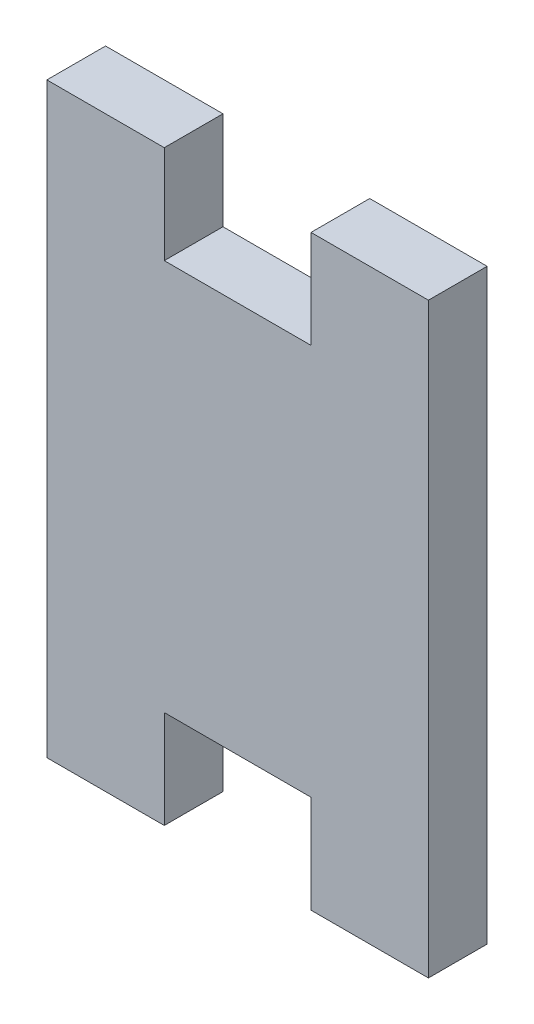
ISO-10303-21;
HEADER;
FILE_DESCRIPTION(('STEP AP214'),'2;1');
FILE_NAME('part.step','',(''),(''),'','','');
FILE_SCHEMA(('AUTOMOTIVE_DESIGN { 1 0 10303 214 1 1 1 1 }'));
ENDSEC;
DATA;
#1=APPLICATION_CONTEXT('core data for automotive mechanical design processes');
#2=APPLICATION_PROTOCOL_DEFINITION('international standard','automotive_design',2000,#1);
#3=PRODUCT_CONTEXT('',#1,'mechanical');
#4=PRODUCT('Part','Part','',(#3));
#5=PRODUCT_RELATED_PRODUCT_CATEGORY('part','',(#4));
#6=PRODUCT_DEFINITION_FORMATION('','',#4);
#7=PRODUCT_DEFINITION_CONTEXT('part definition',#1,'design');
#8=PRODUCT_DEFINITION('design','',#6,#7);
#9=PRODUCT_DEFINITION_SHAPE('','',#8);
#10=(LENGTH_UNIT() NAMED_UNIT(*) SI_UNIT(.MILLI.,.METRE.));
#11=(NAMED_UNIT(*) PLANE_ANGLE_UNIT() SI_UNIT($,.RADIAN.));
#12=(NAMED_UNIT(*) SI_UNIT($,.STERADIAN.) SOLID_ANGLE_UNIT());
#13=UNCERTAINTY_MEASURE_WITH_UNIT(LENGTH_MEASURE(1.E-05),#10,'distance_accuracy_value','');
#14=(GEOMETRIC_REPRESENTATION_CONTEXT(3) GLOBAL_UNCERTAINTY_ASSIGNED_CONTEXT((#13)) GLOBAL_UNIT_ASSIGNED_CONTEXT((#10,
#11,#12)) REPRESENTATION_CONTEXT('',''));
#15=CARTESIAN_POINT('',(0.,0.,0.));
#16=DIRECTION('',(0.,0.,1.));
#17=DIRECTION('',(1.,0.,0.));
#18=AXIS2_PLACEMENT_3D('',#15,#16,#17);
#19=CARTESIAN_POINT('',(-9.75,-60.2284678571429,3.));
#20=DIRECTION('',(1.,0.,0.));
#21=DIRECTION('',(0.,0.,-1.));
#22=AXIS2_PLACEMENT_3D('',#19,#20,#21);
#23=PLANE('',#22);
#24=DIRECTION('',(0.,-1.,0.));
#25=VECTOR('',#24,1.);
#26=CARTESIAN_POINT('',(-9.75,-60.2284678571429,0.));
#27=LINE('',#26,#25);
#28=CARTESIAN_POINT('',(-9.75000000000001,-55.2284678571429,0.));
#29=VERTEX_POINT('',#28);
#30=CARTESIAN_POINT('',(-9.75,-85.2284678571429,0.));
#31=VERTEX_POINT('',#30);
#32=EDGE_CURVE('E97',#29,#31,#27,.T.);
#33=ORIENTED_EDGE('',*,*,#32,.T.);
#34=DIRECTION('',(0.,0.,-1.));
#35=VECTOR('',#34,1.);
#36=CARTESIAN_POINT('',(-9.75,-85.2284678571429,3.));
#37=LINE('',#36,#35);
#38=CARTESIAN_POINT('',(-9.75,-85.2284678571429,3.));
#39=VERTEX_POINT('',#38);
#40=EDGE_CURVE('E11',#39,#31,#37,.T.);
#41=ORIENTED_EDGE('',*,*,#40,.F.);
#42=DIRECTION('',(0.,-1.,0.));
#43=VECTOR('',#42,1.);
#44=CARTESIAN_POINT('',(-9.75,-60.2284678571429,3.));
#45=LINE('',#44,#43);
#46=CARTESIAN_POINT('',(-9.75000000000001,-55.2284678571429,3.));
#47=VERTEX_POINT('',#46);
#48=EDGE_CURVE('E103',#47,#39,#45,.T.);
#49=ORIENTED_EDGE('',*,*,#48,.F.);
#50=DIRECTION('',(0.,0.,-1.));
#51=VECTOR('',#50,1.);
#52=CARTESIAN_POINT('',(-9.75000000000001,-55.2284678571429,3.));
#53=LINE('',#52,#51);
#54=EDGE_CURVE('E149',#47,#29,#53,.T.);
#55=ORIENTED_EDGE('',*,*,#54,.T.);
#56=EDGE_LOOP('',(#33,#41,#49,#55));
#57=FACE_BOUND('',#56,.T.);
#58=ADVANCED_FACE('F33',(#57),#23,.F.);
#59=CARTESIAN_POINT('',(-9.75,-85.2284678571429,3.));
#60=DIRECTION('',(0.,1.,0.));
#61=DIRECTION('',(0.,0.,1.));
#62=AXIS2_PLACEMENT_3D('',#59,#60,#61);
#63=PLANE('',#62);
#64=DIRECTION('',(1.,0.,0.));
#65=VECTOR('',#64,1.);
#66=CARTESIAN_POINT('',(-9.75,-85.2284678571429,0.));
#67=LINE('',#66,#65);
#68=CARTESIAN_POINT('',(-3.75,-85.2284678571429,0.));
#69=VERTEX_POINT('',#68);
#70=EDGE_CURVE('E154',#31,#69,#67,.T.);
#71=ORIENTED_EDGE('',*,*,#70,.T.);
#72=DIRECTION('',(0.,0.,-1.));
#73=VECTOR('',#72,1.);
#74=CARTESIAN_POINT('',(-3.75,-85.2284678571429,3.));
#75=LINE('',#74,#73);
#76=CARTESIAN_POINT('',(-3.75,-85.2284678571429,3.));
#77=VERTEX_POINT('',#76);
#78=EDGE_CURVE('E41',#77,#69,#75,.T.);
#79=ORIENTED_EDGE('',*,*,#78,.F.);
#80=DIRECTION('',(1.,0.,0.));
#81=VECTOR('',#80,1.);
#82=CARTESIAN_POINT('',(-9.75,-85.2284678571429,3.));
#83=LINE('',#82,#81);
#84=EDGE_CURVE('E243',#39,#77,#83,.T.);
#85=ORIENTED_EDGE('',*,*,#84,.F.);
#86=ORIENTED_EDGE('',*,*,#40,.T.);
#87=EDGE_LOOP('',(#71,#79,#85,#86));
#88=FACE_BOUND('',#87,.T.);
#89=ADVANCED_FACE('F246',(#88),#63,.F.);
#90=CARTESIAN_POINT('',(-3.75,-80.2284678571429,3.));
#91=DIRECTION('',(-1.,0.,0.));
#92=DIRECTION('',(0.,0.,1.));
#93=AXIS2_PLACEMENT_3D('',#90,#91,#92);
#94=PLANE('',#93);
#95=DIRECTION('',(0.,1.,0.));
#96=VECTOR('',#95,1.);
#97=CARTESIAN_POINT('',(-3.75,-80.2284678571429,0.));
#98=LINE('',#97,#96);
#99=CARTESIAN_POINT('',(-3.75,-80.2284678571429,0.));
#100=VERTEX_POINT('',#99);
#101=EDGE_CURVE('E156',#69,#100,#98,.T.);
#102=ORIENTED_EDGE('',*,*,#101,.T.);
#103=DIRECTION('',(0.,0.,-1.));
#104=VECTOR('',#103,1.);
#105=CARTESIAN_POINT('',(-3.75,-80.2284678571429,3.));
#106=LINE('',#105,#104);
#107=CARTESIAN_POINT('',(-3.75,-80.2284678571429,3.));
#108=VERTEX_POINT('',#107);
#109=EDGE_CURVE('E194',#108,#100,#106,.T.);
#110=ORIENTED_EDGE('',*,*,#109,.F.);
#111=DIRECTION('',(0.,1.,0.));
#112=VECTOR('',#111,1.);
#113=CARTESIAN_POINT('',(-3.75,-80.2284678571429,3.));
#114=LINE('',#113,#112);
#115=EDGE_CURVE('E203',#77,#108,#114,.T.);
#116=ORIENTED_EDGE('',*,*,#115,.F.);
#117=ORIENTED_EDGE('',*,*,#78,.T.);
#118=EDGE_LOOP('',(#102,#110,#116,#117));
#119=FACE_BOUND('',#118,.T.);
#120=ADVANCED_FACE('F201',(#119),#94,.F.);
#121=CARTESIAN_POINT('',(-3.75,-80.2284678571429,3.));
#122=DIRECTION('',(0.,1.,0.));
#123=DIRECTION('',(0.,0.,1.));
#124=AXIS2_PLACEMENT_3D('',#121,#122,#123);
#125=PLANE('',#124);
#126=DIRECTION('',(1.,0.,0.));
#127=VECTOR('',#126,1.);
#128=CARTESIAN_POINT('',(-3.75,-80.2284678571429,0.));
#129=LINE('',#128,#127);
#130=CARTESIAN_POINT('',(3.75,-80.2284678571429,0.));
#131=VERTEX_POINT('',#130);
#132=EDGE_CURVE('E158',#100,#131,#129,.T.);
#133=ORIENTED_EDGE('',*,*,#132,.T.);
#134=DIRECTION('',(0.,0.,-1.));
#135=VECTOR('',#134,1.);
#136=CARTESIAN_POINT('',(3.75,-80.2284678571429,3.));
#137=LINE('',#136,#135);
#138=CARTESIAN_POINT('',(3.75,-80.2284678571429,3.));
#139=VERTEX_POINT('',#138);
#140=EDGE_CURVE('E191',#139,#131,#137,.T.);
#141=ORIENTED_EDGE('',*,*,#140,.F.);
#142=DIRECTION('',(1.,0.,0.));
#143=VECTOR('',#142,1.);
#144=CARTESIAN_POINT('',(-3.75,-80.2284678571429,3.));
#145=LINE('',#144,#143);
#146=EDGE_CURVE('E221',#108,#139,#145,.T.);
#147=ORIENTED_EDGE('',*,*,#146,.F.);
#148=ORIENTED_EDGE('',*,*,#109,.T.);
#149=EDGE_LOOP('',(#133,#141,#147,#148));
#150=FACE_BOUND('',#149,.T.);
#151=ADVANCED_FACE('F212',(#150),#125,.F.);
#152=CARTESIAN_POINT('',(3.75,-80.2284678571429,3.));
#153=DIRECTION('',(1.,0.,0.));
#154=DIRECTION('',(0.,1.,0.));
#155=AXIS2_PLACEMENT_3D('',#152,#153,#154);
#156=PLANE('',#155);
#157=DIRECTION('',(0.,-1.,0.));
#158=VECTOR('',#157,1.);
#159=CARTESIAN_POINT('',(3.75,-80.2284678571429,0.));
#160=LINE('',#159,#158);
#161=CARTESIAN_POINT('',(3.75,-85.2284678571429,0.));
#162=VERTEX_POINT('',#161);
#163=EDGE_CURVE('E160',#131,#162,#160,.T.);
#164=ORIENTED_EDGE('',*,*,#163,.T.);
#165=DIRECTION('',(0.,0.,-1.));
#166=VECTOR('',#165,1.);
#167=CARTESIAN_POINT('',(3.75,-85.2284678571429,3.));
#168=LINE('',#167,#166);
#169=CARTESIAN_POINT('',(3.75,-85.2284678571429,3.));
#170=VERTEX_POINT('',#169);
#171=EDGE_CURVE('E188',#170,#162,#168,.T.);
#172=ORIENTED_EDGE('',*,*,#171,.F.);
#173=DIRECTION('',(0.,-1.,0.));
#174=VECTOR('',#173,1.);
#175=CARTESIAN_POINT('',(3.75,-80.2284678571429,3.));
#176=LINE('',#175,#174);
#177=EDGE_CURVE('E218',#139,#170,#176,.T.);
#178=ORIENTED_EDGE('',*,*,#177,.F.);
#179=ORIENTED_EDGE('',*,*,#140,.T.);
#180=EDGE_LOOP('',(#164,#172,#178,#179));
#181=FACE_BOUND('',#180,.T.);
#182=ADVANCED_FACE('F216',(#181),#156,.F.);
#183=CARTESIAN_POINT('',(3.75,-85.2284678571429,3.));
#184=DIRECTION('',(0.,1.,0.));
#185=DIRECTION('',(0.,0.,1.));
#186=AXIS2_PLACEMENT_3D('',#183,#184,#185);
#187=PLANE('',#186);
#188=DIRECTION('',(1.,0.,0.));
#189=VECTOR('',#188,1.);
#190=CARTESIAN_POINT('',(3.75,-85.2284678571429,0.));
#191=LINE('',#190,#189);
#192=CARTESIAN_POINT('',(9.75,-85.2284678571429,0.));
#193=VERTEX_POINT('',#192);
#194=EDGE_CURVE('E162',#162,#193,#191,.T.);
#195=ORIENTED_EDGE('',*,*,#194,.T.);
#196=DIRECTION('',(0.,0.,-1.));
#197=VECTOR('',#196,1.);
#198=CARTESIAN_POINT('',(9.75,-85.2284678571429,3.));
#199=LINE('',#198,#197);
#200=CARTESIAN_POINT('',(9.75,-85.2284678571429,3.));
#201=VERTEX_POINT('',#200);
#202=EDGE_CURVE('E185',#201,#193,#199,.T.);
#203=ORIENTED_EDGE('',*,*,#202,.F.);
#204=DIRECTION('',(1.,0.,0.));
#205=VECTOR('',#204,1.);
#206=CARTESIAN_POINT('',(3.75,-85.2284678571429,3.));
#207=LINE('',#206,#205);
#208=EDGE_CURVE('E220',#170,#201,#207,.T.);
#209=ORIENTED_EDGE('',*,*,#208,.F.);
#210=ORIENTED_EDGE('',*,*,#171,.T.);
#211=EDGE_LOOP('',(#195,#203,#209,#210));
#212=FACE_BOUND('',#211,.T.);
#213=ADVANCED_FACE('F258',(#212),#187,.F.);
#214=CARTESIAN_POINT('',(9.75,-60.2284678571429,3.));
#215=DIRECTION('',(-1.,0.,0.));
#216=DIRECTION('',(0.,0.,1.));
#217=AXIS2_PLACEMENT_3D('',#214,#215,#216);
#218=PLANE('',#217);
#219=DIRECTION('',(0.,1.,0.));
#220=VECTOR('',#219,1.);
#221=CARTESIAN_POINT('',(9.75,-60.2284678571429,0.));
#222=LINE('',#221,#220);
#223=CARTESIAN_POINT('',(9.75,-55.2284678571429,0.));
#224=VERTEX_POINT('',#223);
#225=EDGE_CURVE('E165',#193,#224,#222,.T.);
#226=ORIENTED_EDGE('',*,*,#225,.T.);
#227=DIRECTION('',(0.,0.,-1.));
#228=VECTOR('',#227,1.);
#229=CARTESIAN_POINT('',(9.75,-55.2284678571429,3.));
#230=LINE('',#229,#228);
#231=CARTESIAN_POINT('',(9.75,-55.2284678571429,3.));
#232=VERTEX_POINT('',#231);
#233=EDGE_CURVE('E182',#232,#224,#230,.T.);
#234=ORIENTED_EDGE('',*,*,#233,.F.);
#235=DIRECTION('',(0.,1.,0.));
#236=VECTOR('',#235,1.);
#237=CARTESIAN_POINT('',(9.75,-85.2284678571429,3.));
#238=LINE('',#237,#236);
#239=EDGE_CURVE('E223',#201,#232,#238,.T.);
#240=ORIENTED_EDGE('',*,*,#239,.F.);
#241=ORIENTED_EDGE('',*,*,#202,.T.);
#242=EDGE_LOOP('',(#226,#234,#240,#241));
#243=FACE_BOUND('',#242,.T.);
#244=ADVANCED_FACE('F261',(#243),#218,.F.);
#245=CARTESIAN_POINT('',(9.75,-55.2284678571429,3.));
#246=DIRECTION('',(0.,-1.,0.));
#247=DIRECTION('',(0.,0.,-1.));
#248=AXIS2_PLACEMENT_3D('',#245,#246,#247);
#249=PLANE('',#248);
#250=DIRECTION('',(-1.,0.,0.));
#251=VECTOR('',#250,1.);
#252=CARTESIAN_POINT('',(9.75,-55.2284678571429,0.));
#253=LINE('',#252,#251);
#254=CARTESIAN_POINT('',(3.75,-55.2284678571429,0.));
#255=VERTEX_POINT('',#254);
#256=EDGE_CURVE('E167',#224,#255,#253,.T.);
#257=ORIENTED_EDGE('',*,*,#256,.T.);
#258=DIRECTION('',(0.,0.,-1.));
#259=VECTOR('',#258,1.);
#260=CARTESIAN_POINT('',(3.75,-55.2284678571429,3.));
#261=LINE('',#260,#259);
#262=CARTESIAN_POINT('',(3.75,-55.2284678571429,3.));
#263=VERTEX_POINT('',#262);
#264=EDGE_CURVE('E179',#263,#255,#261,.T.);
#265=ORIENTED_EDGE('',*,*,#264,.F.);
#266=DIRECTION('',(-1.,0.,0.));
#267=VECTOR('',#266,1.);
#268=CARTESIAN_POINT('',(9.75,-55.2284678571429,3.));
#269=LINE('',#268,#267);
#270=EDGE_CURVE('E229',#232,#263,#269,.T.);
#271=ORIENTED_EDGE('',*,*,#270,.F.);
#272=ORIENTED_EDGE('',*,*,#233,.T.);
#273=EDGE_LOOP('',(#257,#265,#271,#272));
#274=FACE_BOUND('',#273,.T.);
#275=ADVANCED_FACE('F235',(#274),#249,.F.);
#276=CARTESIAN_POINT('',(3.75,-55.2284678571429,3.));
#277=DIRECTION('',(1.,0.,0.));
#278=DIRECTION('',(0.,1.,0.));
#279=AXIS2_PLACEMENT_3D('',#276,#277,#278);
#280=PLANE('',#279);
#281=DIRECTION('',(0.,-1.,0.));
#282=VECTOR('',#281,1.);
#283=CARTESIAN_POINT('',(3.75,-55.2284678571429,0.));
#284=LINE('',#283,#282);
#285=CARTESIAN_POINT('',(3.75,-60.2284678571429,0.));
#286=VERTEX_POINT('',#285);
#287=EDGE_CURVE('E169',#255,#286,#284,.T.);
#288=ORIENTED_EDGE('',*,*,#287,.T.);
#289=DIRECTION('',(0.,0.,-1.));
#290=VECTOR('',#289,1.);
#291=CARTESIAN_POINT('',(3.75,-60.2284678571429,3.));
#292=LINE('',#291,#290);
#293=CARTESIAN_POINT('',(3.75,-60.2284678571429,3.));
#294=VERTEX_POINT('',#293);
#295=EDGE_CURVE('E144',#294,#286,#292,.T.);
#296=ORIENTED_EDGE('',*,*,#295,.F.);
#297=DIRECTION('',(0.,-1.,0.));
#298=VECTOR('',#297,1.);
#299=CARTESIAN_POINT('',(3.75,-55.2284678571429,3.));
#300=LINE('',#299,#298);
#301=EDGE_CURVE('E135',#263,#294,#300,.T.);
#302=ORIENTED_EDGE('',*,*,#301,.F.);
#303=ORIENTED_EDGE('',*,*,#264,.T.);
#304=EDGE_LOOP('',(#288,#296,#302,#303));
#305=FACE_BOUND('',#304,.T.);
#306=ADVANCED_FACE('F239',(#305),#280,.F.);
#307=CARTESIAN_POINT('',(-3.75,-60.2284678571429,3.));
#308=DIRECTION('',(0.,-1.,0.));
#309=DIRECTION('',(0.,0.,-1.));
#310=AXIS2_PLACEMENT_3D('',#307,#308,#309);
#311=PLANE('',#310);
#312=DIRECTION('',(-1.,0.,0.));
#313=VECTOR('',#312,1.);
#314=CARTESIAN_POINT('',(-3.75,-60.2284678571429,0.));
#315=LINE('',#314,#313);
#316=CARTESIAN_POINT('',(-3.75,-60.2284678571429,0.));
#317=VERTEX_POINT('',#316);
#318=EDGE_CURVE('E143',#286,#317,#315,.T.);
#319=ORIENTED_EDGE('',*,*,#318,.T.);
#320=DIRECTION('',(0.,0.,-1.));
#321=VECTOR('',#320,1.);
#322=CARTESIAN_POINT('',(-3.75,-60.2284678571429,3.));
#323=LINE('',#322,#321);
#324=CARTESIAN_POINT('',(-3.75,-60.2284678571429,3.));
#325=VERTEX_POINT('',#324);
#326=EDGE_CURVE('E140',#325,#317,#323,.T.);
#327=ORIENTED_EDGE('',*,*,#326,.F.);
#328=DIRECTION('',(-1.,0.,0.));
#329=VECTOR('',#328,1.);
#330=CARTESIAN_POINT('',(-3.75,-60.2284678571429,3.));
#331=LINE('',#330,#329);
#332=EDGE_CURVE('E129',#294,#325,#331,.T.);
#333=ORIENTED_EDGE('',*,*,#332,.F.);
#334=ORIENTED_EDGE('',*,*,#295,.T.);
#335=EDGE_LOOP('',(#319,#327,#333,#334));
#336=FACE_BOUND('',#335,.T.);
#337=ADVANCED_FACE('F141',(#336),#311,.F.);
#338=CARTESIAN_POINT('',(-3.75,-55.2284678571429,3.));
#339=DIRECTION('',(-1.,0.,0.));
#340=DIRECTION('',(0.,0.,1.));
#341=AXIS2_PLACEMENT_3D('',#338,#339,#340);
#342=PLANE('',#341);
#343=DIRECTION('',(0.,1.,0.));
#344=VECTOR('',#343,1.);
#345=CARTESIAN_POINT('',(-3.75,-55.2284678571429,0.));
#346=LINE('',#345,#344);
#347=CARTESIAN_POINT('',(-3.75,-55.2284678571429,0.));
#348=VERTEX_POINT('',#347);
#349=EDGE_CURVE('E90',#317,#348,#346,.T.);
#350=ORIENTED_EDGE('',*,*,#349,.T.);
#351=DIRECTION('',(0.,0.,-1.));
#352=VECTOR('',#351,1.);
#353=CARTESIAN_POINT('',(-3.75,-55.2284678571429,3.));
#354=LINE('',#353,#352);
#355=CARTESIAN_POINT('',(-3.75,-55.2284678571429,3.));
#356=VERTEX_POINT('',#355);
#357=EDGE_CURVE('E145',#356,#348,#354,.T.);
#358=ORIENTED_EDGE('',*,*,#357,.F.);
#359=DIRECTION('',(0.,1.,0.));
#360=VECTOR('',#359,1.);
#361=CARTESIAN_POINT('',(-3.75,-55.2284678571429,3.));
#362=LINE('',#361,#360);
#363=EDGE_CURVE('E133',#325,#356,#362,.T.);
#364=ORIENTED_EDGE('',*,*,#363,.F.);
#365=ORIENTED_EDGE('',*,*,#326,.T.);
#366=EDGE_LOOP('',(#350,#358,#364,#365));
#367=FACE_BOUND('',#366,.T.);
#368=ADVANCED_FACE('F147',(#367),#342,.F.);
#369=CARTESIAN_POINT('',(-9.75000000000001,-55.2284678571429,3.));
#370=DIRECTION('',(0.,-1.,0.));
#371=DIRECTION('',(0.,0.,-1.));
#372=AXIS2_PLACEMENT_3D('',#369,#370,#371);
#373=PLANE('',#372);
#374=DIRECTION('',(-1.,0.,0.));
#375=VECTOR('',#374,1.);
#376=CARTESIAN_POINT('',(-9.75000000000001,-55.2284678571429,0.));
#377=LINE('',#376,#375);
#378=EDGE_CURVE('E173',#348,#29,#377,.T.);
#379=ORIENTED_EDGE('',*,*,#378,.T.);
#380=ORIENTED_EDGE('',*,*,#54,.F.);
#381=DIRECTION('',(-1.,0.,0.));
#382=VECTOR('',#381,1.);
#383=CARTESIAN_POINT('',(-9.75000000000001,-55.2284678571429,3.));
#384=LINE('',#383,#382);
#385=EDGE_CURVE('E49',#356,#47,#384,.T.);
#386=ORIENTED_EDGE('',*,*,#385,.F.);
#387=ORIENTED_EDGE('',*,*,#357,.T.);
#388=EDGE_LOOP('',(#379,#380,#386,#387));
#389=FACE_BOUND('',#388,.T.);
#390=ADVANCED_FACE('F241',(#389),#373,.F.);
#391=CARTESIAN_POINT('',(0.,0.,3.));
#392=DIRECTION('',(0.,0.,-1.));
#393=DIRECTION('',(-1.,0.,0.));
#394=AXIS2_PLACEMENT_3D('',#391,#392,#393);
#395=PLANE('',#394);
#396=ORIENTED_EDGE('',*,*,#48,.T.);
#397=ORIENTED_EDGE('',*,*,#84,.T.);
#398=ORIENTED_EDGE('',*,*,#115,.T.);
#399=ORIENTED_EDGE('',*,*,#146,.T.);
#400=ORIENTED_EDGE('',*,*,#177,.T.);
#401=ORIENTED_EDGE('',*,*,#208,.T.);
#402=ORIENTED_EDGE('',*,*,#239,.T.);
#403=ORIENTED_EDGE('',*,*,#270,.T.);
#404=ORIENTED_EDGE('',*,*,#301,.T.);
#405=ORIENTED_EDGE('',*,*,#332,.T.);
#406=ORIENTED_EDGE('',*,*,#363,.T.);
#407=ORIENTED_EDGE('',*,*,#385,.T.);
#408=EDGE_LOOP('',(#396,#397,#398,#399,#400,#401,#402,#403,#404,#405,#406,#407));
#409=FACE_BOUND('',#408,.T.);
#410=ADVANCED_FACE('F131',(#409),#395,.F.);
#411=CARTESIAN_POINT('',(0.,0.,0.));
#412=DIRECTION('',(0.,0.,-1.));
#413=DIRECTION('',(-1.,0.,0.));
#414=AXIS2_PLACEMENT_3D('',#411,#412,#413);
#415=PLANE('',#414);
#416=ORIENTED_EDGE('',*,*,#32,.F.);
#417=ORIENTED_EDGE('',*,*,#378,.F.);
#418=ORIENTED_EDGE('',*,*,#349,.F.);
#419=ORIENTED_EDGE('',*,*,#318,.F.);
#420=ORIENTED_EDGE('',*,*,#287,.F.);
#421=ORIENTED_EDGE('',*,*,#256,.F.);
#422=ORIENTED_EDGE('',*,*,#225,.F.);
#423=ORIENTED_EDGE('',*,*,#194,.F.);
#424=ORIENTED_EDGE('',*,*,#163,.F.);
#425=ORIENTED_EDGE('',*,*,#132,.F.);
#426=ORIENTED_EDGE('',*,*,#101,.F.);
#427=ORIENTED_EDGE('',*,*,#70,.F.);
#428=EDGE_LOOP('',(#416,#417,#418,#419,#420,#421,#422,#423,#424,#425,#426,#427));
#429=FACE_BOUND('',#428,.T.);
#430=ADVANCED_FACE('F207',(#429),#415,.T.);
#431=CLOSED_SHELL('',(#58,#89,#120,#151,#182,#213,#244,#275,#306,#337,#368,#390,#410,#430));
#432=MANIFOLD_SOLID_BREP('B2',#431);
#433=ADVANCED_BREP_SHAPE_REPRESENTATION('',(#18,#432),#14);
#434=SHAPE_DEFINITION_REPRESENTATION(#9,#433);
ENDSEC;
END-ISO-10303-21;
